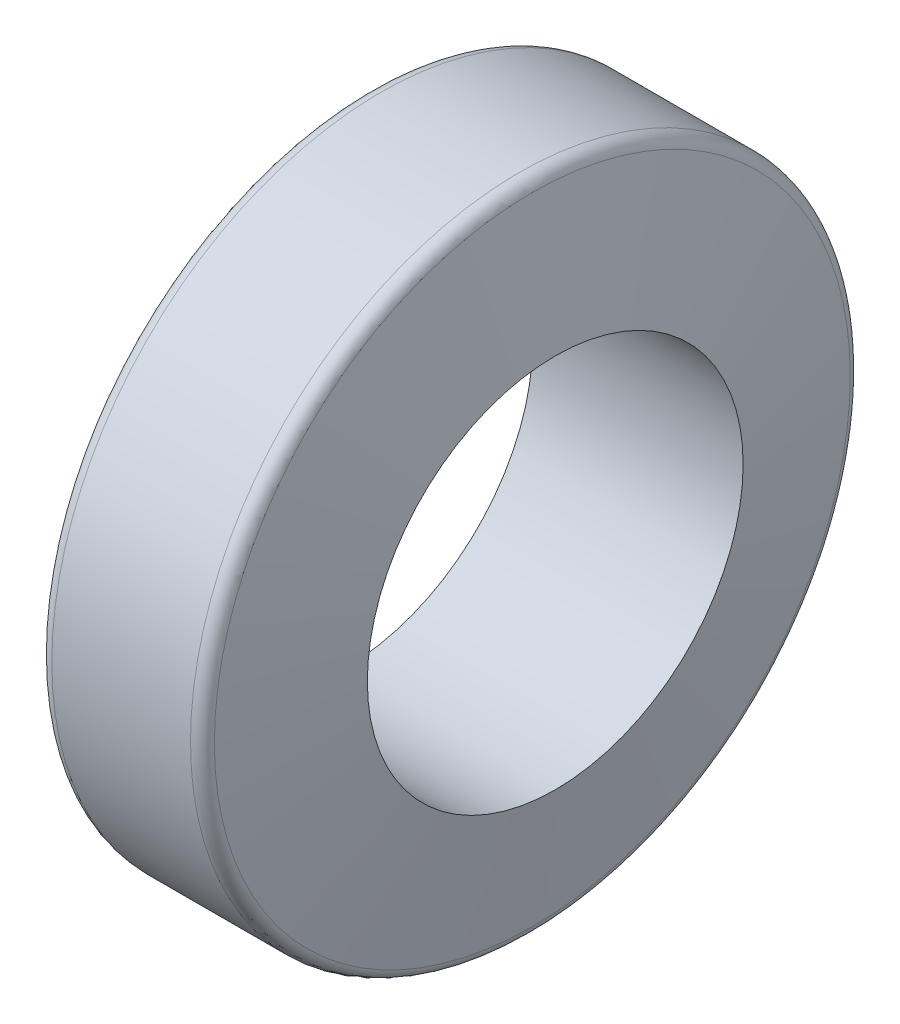
ISO-10303-21;
HEADER;
FILE_DESCRIPTION(('STEP AP214'),'2;1');
FILE_NAME('part.step','',(''),(''),'','','');
FILE_SCHEMA(('AUTOMOTIVE_DESIGN { 1 0 10303 214 1 1 1 1 }'));
ENDSEC;
DATA;
#1=APPLICATION_CONTEXT('core data for automotive mechanical design processes');
#2=APPLICATION_PROTOCOL_DEFINITION('international standard','automotive_design',2000,#1);
#3=PRODUCT_CONTEXT('',#1,'mechanical');
#4=PRODUCT('Part','Part','',(#3));
#5=PRODUCT_RELATED_PRODUCT_CATEGORY('part','',(#4));
#6=PRODUCT_DEFINITION_FORMATION('','',#4);
#7=PRODUCT_DEFINITION_CONTEXT('part definition',#1,'design');
#8=PRODUCT_DEFINITION('design','',#6,#7);
#9=PRODUCT_DEFINITION_SHAPE('','',#8);
#10=(LENGTH_UNIT() NAMED_UNIT(*) SI_UNIT(.MILLI.,.METRE.));
#11=(NAMED_UNIT(*) PLANE_ANGLE_UNIT() SI_UNIT($,.RADIAN.));
#12=(NAMED_UNIT(*) SI_UNIT($,.STERADIAN.) SOLID_ANGLE_UNIT());
#13=UNCERTAINTY_MEASURE_WITH_UNIT(LENGTH_MEASURE(1.E-05),#10,'distance_accuracy_value','');
#14=(GEOMETRIC_REPRESENTATION_CONTEXT(3) GLOBAL_UNCERTAINTY_ASSIGNED_CONTEXT((#13)) GLOBAL_UNIT_ASSIGNED_CONTEXT((#10,
#11,#12)) REPRESENTATION_CONTEXT('',''));
#15=CARTESIAN_POINT('',(0.,0.,0.));
#16=DIRECTION('',(0.,0.,1.));
#17=DIRECTION('',(1.,0.,0.));
#18=AXIS2_PLACEMENT_3D('',#15,#16,#17);
#19=CARTESIAN_POINT('',(-12.512980942774,0.,0.));
#20=DIRECTION('',(1.,0.,0.));
#21=DIRECTION('',(0.,0.,-1.));
#22=AXIS2_PLACEMENT_3D('',#19,#20,#21);
#23=CONICAL_SURFACE('',#22,48.347296355334,1.39626340159545);
#24=CARTESIAN_POINT('',(-16.,0.,0.));
#25=DIRECTION('',(-1.,0.,0.));
#26=DIRECTION('',(0.,0.,1.));
#27=AXIS2_PLACEMENT_3D('',#24,#25,#26);
#28=CIRCLE('',#27,28.571428571429);
#29=CARTESIAN_POINT('',(-16.,0.,28.571428571429));
#30=VERTEX_POINT('',#29);
#31=EDGE_CURVE('E10',#30,#30,#28,.T.);
#32=ORIENTED_EDGE('',*,*,#31,.F.);
#33=EDGE_LOOP('',(#32));
#34=FACE_BOUND('',#33,.T.);
#35=CARTESIAN_POINT('',(-12.512980942774,0.,0.));
#36=DIRECTION('',(-1.,0.,0.));
#37=DIRECTION('',(0.,0.,1.));
#38=AXIS2_PLACEMENT_3D('',#35,#36,#37);
#39=CIRCLE('',#38,48.347296355334);
#40=CARTESIAN_POINT('',(-12.512980942774,0.,48.347296355334));
#41=VERTEX_POINT('',#40);
#42=EDGE_CURVE('E54',#41,#41,#39,.T.);
#43=ORIENTED_EDGE('',*,*,#42,.T.);
#44=EDGE_LOOP('',(#43));
#45=FACE_BOUND('',#44,.T.);
#46=ADVANCED_FACE('F32',(#34,#45),#23,.T.);
#47=CARTESIAN_POINT('',(50.,0.,0.));
#48=DIRECTION('',(-1.,0.,0.));
#49=DIRECTION('',(0.,0.,1.));
#50=AXIS2_PLACEMENT_3D('',#47,#48,#49);
#51=CYLINDRICAL_SURFACE('',#50,28.571428571429);
#52=CARTESIAN_POINT('',(16.,0.,0.));
#53=DIRECTION('',(-1.,0.,0.));
#54=DIRECTION('',(0.,0.,1.));
#55=AXIS2_PLACEMENT_3D('',#52,#53,#54);
#56=CIRCLE('',#55,28.571428571429);
#57=CARTESIAN_POINT('',(16.,0.,28.571428571429));
#58=VERTEX_POINT('',#57);
#59=EDGE_CURVE('E38',#58,#58,#56,.T.);
#60=ORIENTED_EDGE('',*,*,#59,.F.);
#61=EDGE_LOOP('',(#60));
#62=FACE_BOUND('',#61,.T.);
#63=ORIENTED_EDGE('',*,*,#31,.T.);
#64=EDGE_LOOP('',(#63));
#65=FACE_BOUND('',#64,.T.);
#66=ADVANCED_FACE('F79',(#62,#65),#51,.F.);
#67=CARTESIAN_POINT('',(16.,0.,0.));
#68=DIRECTION('',(-1.,0.,0.));
#69=DIRECTION('',(0.,0.,1.));
#70=AXIS2_PLACEMENT_3D('',#67,#68,#69);
#71=CONICAL_SURFACE('',#70,28.571428571429,1.39626340159545);
#72=CARTESIAN_POINT('',(12.512980942774,0.,0.));
#73=DIRECTION('',(-1.,0.,0.));
#74=DIRECTION('',(0.,0.,1.));
#75=AXIS2_PLACEMENT_3D('',#72,#73,#74);
#76=CIRCLE('',#75,48.347296355334);
#77=CARTESIAN_POINT('',(12.512980942774,0.,48.347296355334));
#78=VERTEX_POINT('',#77);
#79=EDGE_CURVE('E42',#78,#78,#76,.T.);
#80=ORIENTED_EDGE('',*,*,#79,.F.);
#81=EDGE_LOOP('',(#80));
#82=FACE_BOUND('',#81,.T.);
#83=ORIENTED_EDGE('',*,*,#59,.T.);
#84=EDGE_LOOP('',(#83));
#85=FACE_BOUND('',#84,.T.);
#86=ADVANCED_FACE('F74',(#82,#85),#71,.T.);
#87=CARTESIAN_POINT('',(10.5433654367502,0.,0.));
#88=DIRECTION('',(-1.,0.,0.));
#89=DIRECTION('',(0.,0.,1.));
#90=AXIS2_PLACEMENT_3D('',#87,#88,#89);
#91=TOROIDAL_SURFACE('',#90,48.0000000000008,1.99999999999925);
#92=CARTESIAN_POINT('',(10.54336543675,0.,0.));
#93=DIRECTION('',(-1.,0.,0.));
#94=DIRECTION('',(0.,0.,1.));
#95=AXIS2_PLACEMENT_3D('',#92,#93,#94);
#96=CIRCLE('',#95,50.);
#97=CARTESIAN_POINT('',(10.54336543675,0.,50.));
#98=VERTEX_POINT('',#97);
#99=EDGE_CURVE('E46',#98,#98,#96,.T.);
#100=ORIENTED_EDGE('',*,*,#99,.F.);
#101=EDGE_LOOP('',(#100));
#102=FACE_BOUND('',#101,.T.);
#103=ORIENTED_EDGE('',*,*,#79,.T.);
#104=EDGE_LOOP('',(#103));
#105=FACE_BOUND('',#104,.T.);
#106=ADVANCED_FACE('F68',(#102,#105),#91,.T.);
#107=CARTESIAN_POINT('',(50.,0.,0.));
#108=DIRECTION('',(-1.,0.,0.));
#109=DIRECTION('',(0.,0.,1.));
#110=AXIS2_PLACEMENT_3D('',#107,#108,#109);
#111=CYLINDRICAL_SURFACE('',#110,50.);
#112=CARTESIAN_POINT('',(-10.54336543675,0.,0.));
#113=DIRECTION('',(-1.,0.,0.));
#114=DIRECTION('',(0.,0.,1.));
#115=AXIS2_PLACEMENT_3D('',#112,#113,#114);
#116=CIRCLE('',#115,50.);
#117=CARTESIAN_POINT('',(-10.54336543675,0.,50.));
#118=VERTEX_POINT('',#117);
#119=EDGE_CURVE('E51',#118,#118,#116,.T.);
#120=ORIENTED_EDGE('',*,*,#119,.F.);
#121=EDGE_LOOP('',(#120));
#122=FACE_BOUND('',#121,.T.);
#123=ORIENTED_EDGE('',*,*,#99,.T.);
#124=EDGE_LOOP('',(#123));
#125=FACE_BOUND('',#124,.T.);
#126=ADVANCED_FACE('F62',(#122,#125),#111,.T.);
#127=CARTESIAN_POINT('',(-10.5433654367503,0.,0.));
#128=DIRECTION('',(-1.,0.,0.));
#129=DIRECTION('',(0.,0.,1.));
#130=AXIS2_PLACEMENT_3D('',#127,#128,#129);
#131=TOROIDAL_SURFACE('',#130,48.0000000000008,1.99999999999923);
#132=ORIENTED_EDGE('',*,*,#42,.F.);
#133=EDGE_LOOP('',(#132));
#134=FACE_BOUND('',#133,.T.);
#135=ORIENTED_EDGE('',*,*,#119,.T.);
#136=EDGE_LOOP('',(#135));
#137=FACE_BOUND('',#136,.T.);
#138=ADVANCED_FACE('F59',(#134,#137),#131,.T.);
#139=CLOSED_SHELL('',(#46,#66,#86,#106,#126,#138));
#140=MANIFOLD_SOLID_BREP('B2',#139);
#141=ADVANCED_BREP_SHAPE_REPRESENTATION('',(#18,#140),#14);
#142=SHAPE_DEFINITION_REPRESENTATION(#9,#141);
ENDSEC;
END-ISO-10303-21;
